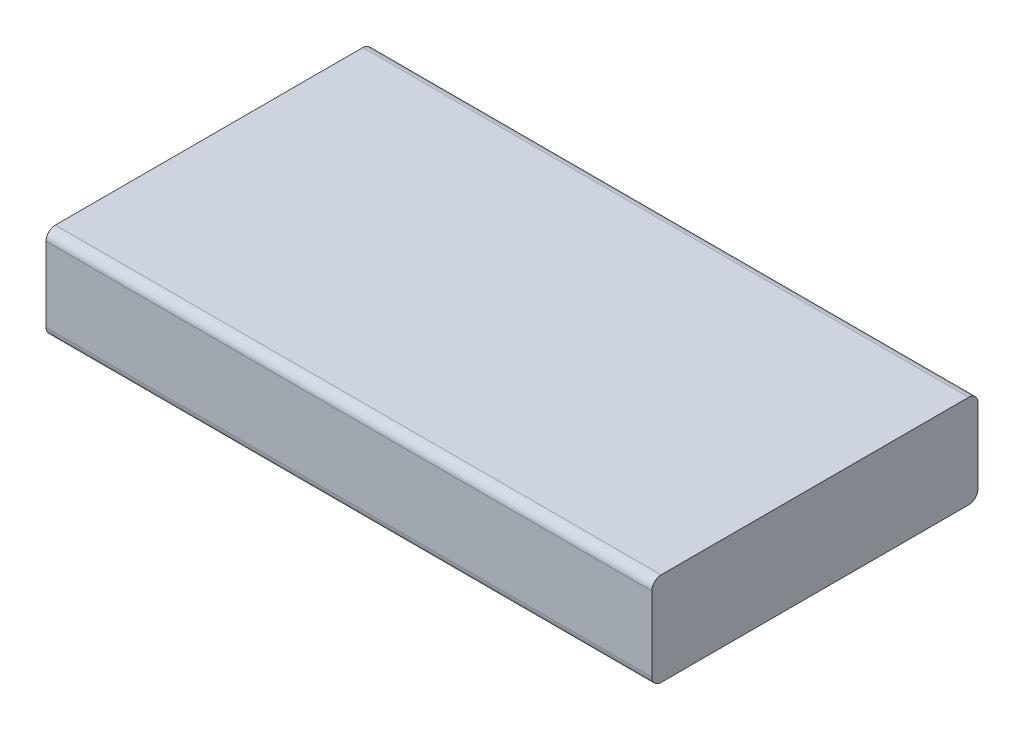
ISO-10303-21;
HEADER;
FILE_DESCRIPTION(('STEP AP214'),'2;1');
FILE_NAME('part.step','',(''),(''),'','','');
FILE_SCHEMA(('AUTOMOTIVE_DESIGN { 1 0 10303 214 1 1 1 1 }'));
ENDSEC;
DATA;
#1=APPLICATION_CONTEXT('core data for automotive mechanical design processes');
#2=APPLICATION_PROTOCOL_DEFINITION('international standard','automotive_design',2000,#1);
#3=PRODUCT_CONTEXT('',#1,'mechanical');
#4=PRODUCT('Part','Part','',(#3));
#5=PRODUCT_RELATED_PRODUCT_CATEGORY('part','',(#4));
#6=PRODUCT_DEFINITION_FORMATION('','',#4);
#7=PRODUCT_DEFINITION_CONTEXT('part definition',#1,'design');
#8=PRODUCT_DEFINITION('design','',#6,#7);
#9=PRODUCT_DEFINITION_SHAPE('','',#8);
#10=(LENGTH_UNIT() NAMED_UNIT(*) SI_UNIT(.MILLI.,.METRE.));
#11=(NAMED_UNIT(*) PLANE_ANGLE_UNIT() SI_UNIT($,.RADIAN.));
#12=(NAMED_UNIT(*) SI_UNIT($,.STERADIAN.) SOLID_ANGLE_UNIT());
#13=UNCERTAINTY_MEASURE_WITH_UNIT(LENGTH_MEASURE(1.E-05),#10,'distance_accuracy_value','');
#14=(GEOMETRIC_REPRESENTATION_CONTEXT(3) GLOBAL_UNCERTAINTY_ASSIGNED_CONTEXT((#13)) GLOBAL_UNIT_ASSIGNED_CONTEXT((#10,
#11,#12)) REPRESENTATION_CONTEXT('',''));
#15=CARTESIAN_POINT('',(0.,0.,0.));
#16=DIRECTION('',(0.,0.,1.));
#17=DIRECTION('',(1.,0.,0.));
#18=AXIS2_PLACEMENT_3D('',#15,#16,#17);
#19=CARTESIAN_POINT('',(65.,0.,0.));
#20=DIRECTION('',(0.,0.,-1.));
#21=DIRECTION('',(-1.,0.,0.));
#22=AXIS2_PLACEMENT_3D('',#19,#20,#21);
#23=PLANE('',#22);
#24=DIRECTION('',(0.,-1.,0.));
#25=VECTOR('',#24,1.);
#26=CARTESIAN_POINT('',(0.,0.,0.));
#27=LINE('',#26,#25);
#28=CARTESIAN_POINT('',(0.,9.,0.));
#29=VERTEX_POINT('',#28);
#30=CARTESIAN_POINT('',(0.,1.,0.));
#31=VERTEX_POINT('',#30);
#32=EDGE_CURVE('E144',#29,#31,#27,.T.);
#33=ORIENTED_EDGE('',*,*,#32,.T.);
#34=DIRECTION('',(-1.,0.,0.));
#35=VECTOR('',#34,1.);
#36=CARTESIAN_POINT('',(65.,1.,0.));
#37=LINE('',#36,#35);
#38=CARTESIAN_POINT('',(65.,1.,0.));
#39=VERTEX_POINT('',#38);
#40=EDGE_CURVE('E177',#31,#39,#37,.F.);
#41=ORIENTED_EDGE('',*,*,#40,.T.);
#42=DIRECTION('',(0.,-1.,0.));
#43=VECTOR('',#42,1.);
#44=CARTESIAN_POINT('',(65.,0.,0.));
#45=LINE('',#44,#43);
#46=CARTESIAN_POINT('',(65.,9.,0.));
#47=VERTEX_POINT('',#46);
#48=EDGE_CURVE('E142',#47,#39,#45,.T.);
#49=ORIENTED_EDGE('',*,*,#48,.F.);
#50=DIRECTION('',(-1.,0.,0.));
#51=VECTOR('',#50,1.);
#52=CARTESIAN_POINT('',(65.,9.,0.));
#53=LINE('',#52,#51);
#54=EDGE_CURVE('E173',#47,#29,#53,.T.);
#55=ORIENTED_EDGE('',*,*,#54,.T.);
#56=EDGE_LOOP('',(#33,#41,#49,#55));
#57=FACE_BOUND('',#56,.T.);
#58=ADVANCED_FACE('F41',(#57),#23,.F.);
#59=CARTESIAN_POINT('',(65.,0.,0.));
#60=DIRECTION('',(0.,1.,0.));
#61=DIRECTION('',(0.,0.,1.));
#62=AXIS2_PLACEMENT_3D('',#59,#60,#61);
#63=PLANE('',#62);
#64=DIRECTION('',(0.,0.,-1.));
#65=VECTOR('',#64,1.);
#66=CARTESIAN_POINT('',(0.,0.,0.));
#67=LINE('',#66,#65);
#68=CARTESIAN_POINT('',(0.,0.,-1.));
#69=VERTEX_POINT('',#68);
#70=CARTESIAN_POINT('',(0.,0.,-34.));
#71=VERTEX_POINT('',#70);
#72=EDGE_CURVE('E138',#69,#71,#67,.T.);
#73=ORIENTED_EDGE('',*,*,#72,.T.);
#74=DIRECTION('',(-1.,0.,0.));
#75=VECTOR('',#74,1.);
#76=CARTESIAN_POINT('',(65.,0.,-34.));
#77=LINE('',#76,#75);
#78=CARTESIAN_POINT('',(65.,0.,-34.));
#79=VERTEX_POINT('',#78);
#80=EDGE_CURVE('E113',#71,#79,#77,.F.);
#81=ORIENTED_EDGE('',*,*,#80,.T.);
#82=DIRECTION('',(0.,0.,-1.));
#83=VECTOR('',#82,1.);
#84=CARTESIAN_POINT('',(65.,0.,0.));
#85=LINE('',#84,#83);
#86=CARTESIAN_POINT('',(65.,0.,-1.));
#87=VERTEX_POINT('',#86);
#88=EDGE_CURVE('E184',#87,#79,#85,.T.);
#89=ORIENTED_EDGE('',*,*,#88,.F.);
#90=DIRECTION('',(-1.,0.,0.));
#91=VECTOR('',#90,1.);
#92=CARTESIAN_POINT('',(65.,0.,-1.));
#93=LINE('',#92,#91);
#94=EDGE_CURVE('E119',#87,#69,#93,.T.);
#95=ORIENTED_EDGE('',*,*,#94,.T.);
#96=EDGE_LOOP('',(#73,#81,#89,#95));
#97=FACE_BOUND('',#96,.T.);
#98=ADVANCED_FACE('F205',(#97),#63,.F.);
#99=CARTESIAN_POINT('',(65.,0.,-35.));
#100=DIRECTION('',(0.,0.,1.));
#101=DIRECTION('',(1.,0.,0.));
#102=AXIS2_PLACEMENT_3D('',#99,#100,#101);
#103=PLANE('',#102);
#104=DIRECTION('',(0.,1.,0.));
#105=VECTOR('',#104,1.);
#106=CARTESIAN_POINT('',(65.,0.,-35.));
#107=LINE('',#106,#105);
#108=CARTESIAN_POINT('',(65.,1.,-35.));
#109=VERTEX_POINT('',#108);
#110=CARTESIAN_POINT('',(65.,9.,-35.));
#111=VERTEX_POINT('',#110);
#112=EDGE_CURVE('E128',#109,#111,#107,.T.);
#113=ORIENTED_EDGE('',*,*,#112,.F.);
#114=DIRECTION('',(-1.,0.,0.));
#115=VECTOR('',#114,1.);
#116=CARTESIAN_POINT('',(65.,1.,-35.));
#117=LINE('',#116,#115);
#118=CARTESIAN_POINT('',(0.,1.,-35.));
#119=VERTEX_POINT('',#118);
#120=EDGE_CURVE('E112',#109,#119,#117,.T.);
#121=ORIENTED_EDGE('',*,*,#120,.T.);
#122=DIRECTION('',(0.,1.,0.));
#123=VECTOR('',#122,1.);
#124=CARTESIAN_POINT('',(0.,0.,-35.));
#125=LINE('',#124,#123);
#126=CARTESIAN_POINT('',(0.,9.,-35.));
#127=VERTEX_POINT('',#126);
#128=EDGE_CURVE('E126',#119,#127,#125,.T.);
#129=ORIENTED_EDGE('',*,*,#128,.T.);
#130=DIRECTION('',(-1.,0.,0.));
#131=VECTOR('',#130,1.);
#132=CARTESIAN_POINT('',(65.,9.,-35.));
#133=LINE('',#132,#131);
#134=EDGE_CURVE('E131',#127,#111,#133,.F.);
#135=ORIENTED_EDGE('',*,*,#134,.T.);
#136=EDGE_LOOP('',(#113,#121,#129,#135));
#137=FACE_BOUND('',#136,.T.);
#138=ADVANCED_FACE('F125',(#137),#103,.F.);
#139=CARTESIAN_POINT('',(65.,10.,0.));
#140=DIRECTION('',(0.,-1.,0.));
#141=DIRECTION('',(0.,0.,-1.));
#142=AXIS2_PLACEMENT_3D('',#139,#140,#141);
#143=PLANE('',#142);
#144=DIRECTION('',(0.,0.,1.));
#145=VECTOR('',#144,1.);
#146=CARTESIAN_POINT('',(65.,10.,0.));
#147=LINE('',#146,#145);
#148=CARTESIAN_POINT('',(65.,10.,-34.));
#149=VERTEX_POINT('',#148);
#150=CARTESIAN_POINT('',(65.,10.,-1.));
#151=VERTEX_POINT('',#150);
#152=EDGE_CURVE('E149',#149,#151,#147,.T.);
#153=ORIENTED_EDGE('',*,*,#152,.F.);
#154=DIRECTION('',(-1.,0.,0.));
#155=VECTOR('',#154,1.);
#156=CARTESIAN_POINT('',(65.,10.,-34.));
#157=LINE('',#156,#155);
#158=CARTESIAN_POINT('',(0.,10.,-34.));
#159=VERTEX_POINT('',#158);
#160=EDGE_CURVE('E11',#149,#159,#157,.T.);
#161=ORIENTED_EDGE('',*,*,#160,.T.);
#162=DIRECTION('',(0.,0.,1.));
#163=VECTOR('',#162,1.);
#164=CARTESIAN_POINT('',(0.,10.,0.));
#165=LINE('',#164,#163);
#166=CARTESIAN_POINT('',(0.,10.,-1.));
#167=VERTEX_POINT('',#166);
#168=EDGE_CURVE('E137',#159,#167,#165,.T.);
#169=ORIENTED_EDGE('',*,*,#168,.T.);
#170=DIRECTION('',(-1.,0.,0.));
#171=VECTOR('',#170,1.);
#172=CARTESIAN_POINT('',(65.,10.,-1.));
#173=LINE('',#172,#171);
#174=EDGE_CURVE('E50',#167,#151,#173,.F.);
#175=ORIENTED_EDGE('',*,*,#174,.T.);
#176=EDGE_LOOP('',(#153,#161,#169,#175));
#177=FACE_BOUND('',#176,.T.);
#178=ADVANCED_FACE('F212',(#177),#143,.F.);
#179=CARTESIAN_POINT('',(65.,0.,0.));
#180=DIRECTION('',(-1.,0.,0.));
#181=DIRECTION('',(0.,0.,1.));
#182=AXIS2_PLACEMENT_3D('',#179,#180,#181);
#183=PLANE('',#182);
#184=ORIENTED_EDGE('',*,*,#88,.T.);
#185=CARTESIAN_POINT('',(65.,1.,-34.));
#186=DIRECTION('',(-1.,0.,0.));
#187=DIRECTION('',(0.,0.,1.));
#188=AXIS2_PLACEMENT_3D('',#185,#186,#187);
#189=CIRCLE('',#188,1.);
#190=EDGE_CURVE('E170',#79,#109,#189,.F.);
#191=ORIENTED_EDGE('',*,*,#190,.T.);
#192=ORIENTED_EDGE('',*,*,#112,.T.);
#193=CARTESIAN_POINT('',(65.,9.,-34.));
#194=DIRECTION('',(-1.,0.,0.));
#195=DIRECTION('',(0.,0.,1.));
#196=AXIS2_PLACEMENT_3D('',#193,#194,#195);
#197=CIRCLE('',#196,1.);
#198=EDGE_CURVE('E63',#111,#149,#197,.F.);
#199=ORIENTED_EDGE('',*,*,#198,.T.);
#200=ORIENTED_EDGE('',*,*,#152,.T.);
#201=CARTESIAN_POINT('',(65.,9.,-1.));
#202=DIRECTION('',(-1.,0.,0.));
#203=DIRECTION('',(0.,0.,1.));
#204=AXIS2_PLACEMENT_3D('',#201,#202,#203);
#205=CIRCLE('',#204,1.);
#206=EDGE_CURVE('E162',#151,#47,#205,.F.);
#207=ORIENTED_EDGE('',*,*,#206,.T.);
#208=ORIENTED_EDGE('',*,*,#48,.T.);
#209=CARTESIAN_POINT('',(65.,1.,-1.));
#210=DIRECTION('',(-1.,0.,0.));
#211=DIRECTION('',(0.,0.,1.));
#212=AXIS2_PLACEMENT_3D('',#209,#210,#211);
#213=CIRCLE('',#212,1.);
#214=EDGE_CURVE('E167',#39,#87,#213,.F.);
#215=ORIENTED_EDGE('',*,*,#214,.T.);
#216=EDGE_LOOP('',(#184,#191,#192,#199,#200,#207,#208,#215));
#217=FACE_BOUND('',#216,.T.);
#218=ADVANCED_FACE('F203',(#217),#183,.F.);
#219=CARTESIAN_POINT('',(0.,0.,0.));
#220=DIRECTION('',(-1.,0.,0.));
#221=DIRECTION('',(0.,0.,1.));
#222=AXIS2_PLACEMENT_3D('',#219,#220,#221);
#223=PLANE('',#222);
#224=ORIENTED_EDGE('',*,*,#128,.F.);
#225=CARTESIAN_POINT('',(0.,1.,-34.));
#226=DIRECTION('',(-1.,0.,0.));
#227=DIRECTION('',(0.,0.,1.));
#228=AXIS2_PLACEMENT_3D('',#225,#226,#227);
#229=CIRCLE('',#228,1.);
#230=EDGE_CURVE('E108',#119,#71,#229,.T.);
#231=ORIENTED_EDGE('',*,*,#230,.T.);
#232=ORIENTED_EDGE('',*,*,#72,.F.);
#233=CARTESIAN_POINT('',(0.,1.,-1.));
#234=DIRECTION('',(-1.,0.,0.));
#235=DIRECTION('',(0.,0.,1.));
#236=AXIS2_PLACEMENT_3D('',#233,#234,#235);
#237=CIRCLE('',#236,1.);
#238=EDGE_CURVE('E120',#69,#31,#237,.T.);
#239=ORIENTED_EDGE('',*,*,#238,.T.);
#240=ORIENTED_EDGE('',*,*,#32,.F.);
#241=CARTESIAN_POINT('',(0.,9.,-1.));
#242=DIRECTION('',(-1.,0.,0.));
#243=DIRECTION('',(0.,0.,1.));
#244=AXIS2_PLACEMENT_3D('',#241,#242,#243);
#245=CIRCLE('',#244,1.);
#246=EDGE_CURVE('E130',#29,#167,#245,.T.);
#247=ORIENTED_EDGE('',*,*,#246,.T.);
#248=ORIENTED_EDGE('',*,*,#168,.F.);
#249=CARTESIAN_POINT('',(0.,9.,-34.));
#250=DIRECTION('',(-1.,0.,0.));
#251=DIRECTION('',(0.,0.,1.));
#252=AXIS2_PLACEMENT_3D('',#249,#250,#251);
#253=CIRCLE('',#252,1.);
#254=EDGE_CURVE('E135',#159,#127,#253,.T.);
#255=ORIENTED_EDGE('',*,*,#254,.T.);
#256=EDGE_LOOP('',(#224,#231,#232,#239,#240,#247,#248,#255));
#257=FACE_BOUND('',#256,.T.);
#258=ADVANCED_FACE('F133',(#257),#223,.T.);
#259=CARTESIAN_POINT('',(65.,1.,-34.));
#260=DIRECTION('',(-1.,0.,0.));
#261=DIRECTION('',(0.,0.,1.));
#262=AXIS2_PLACEMENT_3D('',#259,#260,#261);
#263=CYLINDRICAL_SURFACE('',#262,1.);
#264=ORIENTED_EDGE('',*,*,#190,.F.);
#265=ORIENTED_EDGE('',*,*,#80,.F.);
#266=ORIENTED_EDGE('',*,*,#230,.F.);
#267=ORIENTED_EDGE('',*,*,#120,.F.);
#268=EDGE_LOOP('',(#264,#265,#266,#267));
#269=FACE_BOUND('',#268,.T.);
#270=ADVANCED_FACE('F111',(#269),#263,.T.);
#271=CARTESIAN_POINT('',(65.,1.,-1.));
#272=DIRECTION('',(-1.,0.,0.));
#273=DIRECTION('',(0.,0.,1.));
#274=AXIS2_PLACEMENT_3D('',#271,#272,#273);
#275=CYLINDRICAL_SURFACE('',#274,1.);
#276=ORIENTED_EDGE('',*,*,#214,.F.);
#277=ORIENTED_EDGE('',*,*,#40,.F.);
#278=ORIENTED_EDGE('',*,*,#238,.F.);
#279=ORIENTED_EDGE('',*,*,#94,.F.);
#280=EDGE_LOOP('',(#276,#277,#278,#279));
#281=FACE_BOUND('',#280,.T.);
#282=ADVANCED_FACE('F200',(#281),#275,.T.);
#283=CARTESIAN_POINT('',(65.,9.,-34.));
#284=DIRECTION('',(-1.,0.,0.));
#285=DIRECTION('',(0.,0.,1.));
#286=AXIS2_PLACEMENT_3D('',#283,#284,#285);
#287=CYLINDRICAL_SURFACE('',#286,1.);
#288=ORIENTED_EDGE('',*,*,#198,.F.);
#289=ORIENTED_EDGE('',*,*,#134,.F.);
#290=ORIENTED_EDGE('',*,*,#254,.F.);
#291=ORIENTED_EDGE('',*,*,#160,.F.);
#292=EDGE_LOOP('',(#288,#289,#290,#291));
#293=FACE_BOUND('',#292,.T.);
#294=ADVANCED_FACE('F220',(#293),#287,.T.);
#295=CARTESIAN_POINT('',(65.,9.,-1.));
#296=DIRECTION('',(-1.,0.,0.));
#297=DIRECTION('',(0.,0.,1.));
#298=AXIS2_PLACEMENT_3D('',#295,#296,#297);
#299=CYLINDRICAL_SURFACE('',#298,1.);
#300=ORIENTED_EDGE('',*,*,#206,.F.);
#301=ORIENTED_EDGE('',*,*,#174,.F.);
#302=ORIENTED_EDGE('',*,*,#246,.F.);
#303=ORIENTED_EDGE('',*,*,#54,.F.);
#304=EDGE_LOOP('',(#300,#301,#302,#303));
#305=FACE_BOUND('',#304,.T.);
#306=ADVANCED_FACE('F43',(#305),#299,.T.);
#307=CLOSED_SHELL('',(#58,#98,#138,#178,#218,#258,#270,#282,#294,#306));
#308=MANIFOLD_SOLID_BREP('B2',#307);
#309=ADVANCED_BREP_SHAPE_REPRESENTATION('',(#18,#308),#14);
#310=SHAPE_DEFINITION_REPRESENTATION(#9,#309);
ENDSEC;
END-ISO-10303-21;
